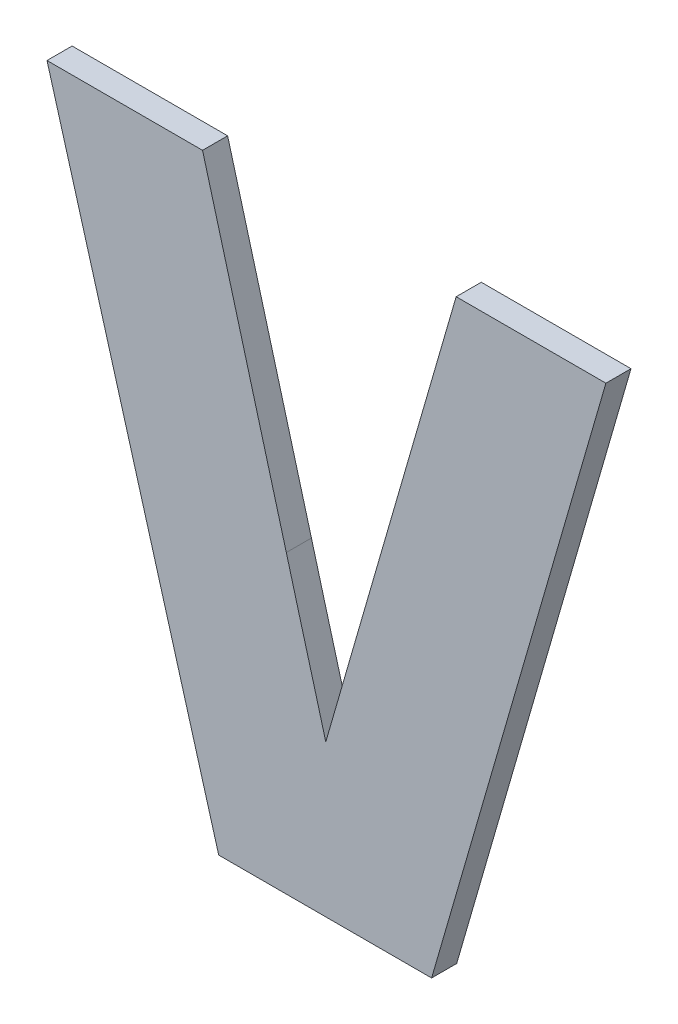
ISO-10303-21;
HEADER;
FILE_DESCRIPTION(('STEP AP214'),'2;1');
FILE_NAME('part.step','',(''),(''),'','','');
FILE_SCHEMA(('AUTOMOTIVE_DESIGN { 1 0 10303 214 1 1 1 1 }'));
ENDSEC;
DATA;
#1=APPLICATION_CONTEXT('core data for automotive mechanical design processes');
#2=APPLICATION_PROTOCOL_DEFINITION('international standard','automotive_design',2000,#1);
#3=PRODUCT_CONTEXT('',#1,'mechanical');
#4=PRODUCT('Part','Part','',(#3));
#5=PRODUCT_RELATED_PRODUCT_CATEGORY('part','',(#4));
#6=PRODUCT_DEFINITION_FORMATION('','',#4);
#7=PRODUCT_DEFINITION_CONTEXT('part definition',#1,'design');
#8=PRODUCT_DEFINITION('design','',#6,#7);
#9=PRODUCT_DEFINITION_SHAPE('','',#8);
#10=(LENGTH_UNIT() NAMED_UNIT(*) SI_UNIT(.MILLI.,.METRE.));
#11=(NAMED_UNIT(*) PLANE_ANGLE_UNIT() SI_UNIT($,.RADIAN.));
#12=(NAMED_UNIT(*) SI_UNIT($,.STERADIAN.) SOLID_ANGLE_UNIT());
#13=UNCERTAINTY_MEASURE_WITH_UNIT(LENGTH_MEASURE(1.E-05),#10,'distance_accuracy_value','');
#14=(GEOMETRIC_REPRESENTATION_CONTEXT(3) GLOBAL_UNCERTAINTY_ASSIGNED_CONTEXT((#13)) GLOBAL_UNIT_ASSIGNED_CONTEXT((#10,
#11,#12)) REPRESENTATION_CONTEXT('',''));
#15=CARTESIAN_POINT('',(0.,0.,0.));
#16=DIRECTION('',(0.,0.,1.));
#17=DIRECTION('',(1.,0.,0.));
#18=AXIS2_PLACEMENT_3D('',#15,#16,#17);
#19=CARTESIAN_POINT('',(1.78786057692204,-12.5,0.5));
#20=DIRECTION('',(0.,1.,0.));
#21=DIRECTION('',(0.,0.,1.));
#22=AXIS2_PLACEMENT_3D('',#19,#20,#21);
#23=PLANE('',#22);
#24=DIRECTION('',(-1.,0.,0.));
#25=VECTOR('',#24,1.);
#26=CARTESIAN_POINT('',(1.78786057692204,-12.5,1.));
#27=LINE('',#26,#25);
#28=CARTESIAN_POINT('',(1.78786057692204,-12.5,1.));
#29=VERTEX_POINT('',#28);
#30=CARTESIAN_POINT('',(-2.45392628205232,-12.5,1.));
#31=VERTEX_POINT('',#30);
#32=EDGE_CURVE('E123',#29,#31,#27,.T.);
#33=ORIENTED_EDGE('',*,*,#32,.T.);
#34=DIRECTION('',(0.,0.,1.));
#35=VECTOR('',#34,1.);
#36=CARTESIAN_POINT('',(-2.45392628205232,-12.5,0.5));
#37=LINE('',#36,#35);
#38=CARTESIAN_POINT('',(-2.45392628205232,-12.5,0.5));
#39=VERTEX_POINT('',#38);
#40=EDGE_CURVE('E125',#39,#31,#37,.T.);
#41=ORIENTED_EDGE('',*,*,#40,.F.);
#42=DIRECTION('',(-1.,0.,0.));
#43=VECTOR('',#42,1.);
#44=CARTESIAN_POINT('',(1.78786057692204,-12.5,0.5));
#45=LINE('',#44,#43);
#46=CARTESIAN_POINT('',(1.78786057692204,-12.5,0.5));
#47=VERTEX_POINT('',#46);
#48=EDGE_CURVE('E115',#47,#39,#45,.T.);
#49=ORIENTED_EDGE('',*,*,#48,.F.);
#50=DIRECTION('',(0.,0.,1.));
#51=VECTOR('',#50,1.);
#52=CARTESIAN_POINT('',(1.78786057692204,-12.5,0.5));
#53=LINE('',#52,#51);
#54=EDGE_CURVE('E113',#47,#29,#53,.T.);
#55=ORIENTED_EDGE('',*,*,#54,.T.);
#56=EDGE_LOOP('',(#33,#41,#49,#55));
#57=FACE_BOUND('',#56,.T.);
#58=ADVANCED_FACE('F39',(#57),#23,.F.);
#59=CARTESIAN_POINT('',(-0.32051282051386,-9.48016826923077,0.5));
#60=CARTESIAN_POINT('',(-0.227569577013121,-9.15282227397761,0.5));
#61=CARTESIAN_POINT('',(-0.0515148779217082,-8.53275782902831,0.5));
#62=CARTESIAN_POINT('',(0.204879934053548,-7.66094431447623,0.5));
#63=CARTESIAN_POINT('',(0.425315182795826,-6.89592763521583,0.5));
#64=CARTESIAN_POINT('',(0.562495621886022,-6.42359049696538,0.5));
#65=CARTESIAN_POINT('',(0.626001602563063,-6.20492788461538,0.5));
#66=B_SPLINE_CURVE_WITH_KNOTS('',3,(#59,#60,#61,#62,#63,#64,#65),.UNSPECIFIED.,.F.,.F.,(4,1,1,1,
4),(0.,0.299433006450165,0.567191178863927,0.799636531168644,1.),.UNSPECIFIED.);
#67=DIRECTION('',(0.,0.,1.));
#68=VECTOR('',#67,1.);
#69=SURFACE_OF_LINEAR_EXTRUSION('',#66,#68);
#70=CARTESIAN_POINT('',(-0.32051282051386,-9.48016826923077,1.));
#71=CARTESIAN_POINT('',(-0.227569577013121,-9.15282227397761,1.));
#72=CARTESIAN_POINT('',(-0.0515148779217082,-8.53275782902831,1.));
#73=CARTESIAN_POINT('',(0.204879934053548,-7.66094431447623,1.));
#74=CARTESIAN_POINT('',(0.425315182795826,-6.89592763521583,1.));
#75=CARTESIAN_POINT('',(0.562495621886022,-6.42359049696538,1.));
#76=CARTESIAN_POINT('',(0.626001602563063,-6.20492788461538,1.));
#77=B_SPLINE_CURVE_WITH_KNOTS('',3,(#70,#71,#72,#73,#74,#75,#76),.UNSPECIFIED.,.F.,.F.,(4,1,1,1,
4),(0.,0.299433006450165,0.567191178863927,0.799636531168644,1.),.UNSPECIFIED.);
#78=CARTESIAN_POINT('',(-0.32051282051386,-9.48016826923077,1.));
#79=VERTEX_POINT('',#78);
#80=CARTESIAN_POINT('',(0.626001602563063,-6.20492788461538,1.));
#81=VERTEX_POINT('',#80);
#82=EDGE_CURVE('E118',#79,#81,#77,.T.);
#83=ORIENTED_EDGE('',*,*,#82,.T.);
#84=DIRECTION('',(0.,0.,1.));
#85=VECTOR('',#84,1.);
#86=CARTESIAN_POINT('',(0.626001602563063,-6.20492788461538,0.5));
#87=LINE('',#86,#85);
#88=CARTESIAN_POINT('',(0.626001602563063,-6.20492788461538,0.5));
#89=VERTEX_POINT('',#88);
#90=EDGE_CURVE('E139',#89,#81,#87,.T.);
#91=ORIENTED_EDGE('',*,*,#90,.F.);
#92=CARTESIAN_POINT('',(-0.32051282051386,-9.48016826923077,0.5));
#93=VERTEX_POINT('',#92);
#94=EDGE_CURVE('E190',#93,#89,#66,.T.);
#95=ORIENTED_EDGE('',*,*,#94,.F.);
#96=DIRECTION('',(0.,0.,1.));
#97=VECTOR('',#96,1.);
#98=CARTESIAN_POINT('',(-0.32051282051386,-9.48016826923077,0.5));
#99=LINE('',#98,#97);
#100=EDGE_CURVE('E163',#93,#79,#99,.T.);
#101=ORIENTED_EDGE('',*,*,#100,.T.);
#102=EDGE_LOOP('',(#83,#91,#95,#101));
#103=FACE_BOUND('',#102,.T.);
#104=ADVANCED_FACE('F200',(#103),#69,.F.);
#105=CARTESIAN_POINT('',(-1.10677083333437,-6.60556891025641,0.5));
#106=CARTESIAN_POINT('',(-1.0543208011643,-6.79234360279481,0.5));
#107=CARTESIAN_POINT('',(-0.954685270709109,-7.14714596986153,0.5));
#108=CARTESIAN_POINT('',(-0.824086425798062,-7.65346097320304,0.5));
#109=CARTESIAN_POINT('',(-0.694575493266769,-8.09874418681304,0.5));
#110=CARTESIAN_POINT('',(-0.591562316920101,-8.48875016605581,0.5));
#111=CARTESIAN_POINT('',(-0.502413037833707,-8.8195488627093,0.5));
#112=CARTESIAN_POINT('',(-0.423467537856964,-9.09017175422705,0.5));
#113=CARTESIAN_POINT('',(-0.372691915008013,-9.30591536239712,0.5));
#114=CARTESIAN_POINT('',(-0.33597334291419,-9.42853761148284,0.5));
#115=CARTESIAN_POINT('',(-0.32051282051386,-9.48016826923077,0.5));
#116=B_SPLINE_CURVE_WITH_KNOTS('',3,(#105,#106,#107,#108,#109,#110,#111,#112,#113,#114,#115),
.UNSPECIFIED.,.F.,.F.,(4,1,1,1,1,1,1,1,4),(0.,0.195279953533646,0.370959195878058,
0.526302240592786,0.662039984591536,0.776996421772981,0.871173310115105,0.945756934130323,1.),.UNSPECIFIED.);
#117=DIRECTION('',(0.,0.,1.));
#118=VECTOR('',#117,1.);
#119=SURFACE_OF_LINEAR_EXTRUSION('',#116,#118);
#120=CARTESIAN_POINT('',(-1.10677083333437,-6.60556891025641,1.));
#121=CARTESIAN_POINT('',(-1.0543208011643,-6.79234360279481,1.));
#122=CARTESIAN_POINT('',(-0.954685270709109,-7.14714596986153,1.));
#123=CARTESIAN_POINT('',(-0.824086425798062,-7.65346097320304,1.));
#124=CARTESIAN_POINT('',(-0.694575493266769,-8.09874418681304,1.));
#125=CARTESIAN_POINT('',(-0.591562316920101,-8.48875016605581,1.));
#126=CARTESIAN_POINT('',(-0.502413037833707,-8.8195488627093,1.));
#127=CARTESIAN_POINT('',(-0.423467537856964,-9.09017175422705,1.));
#128=CARTESIAN_POINT('',(-0.372691915008013,-9.30591536239712,1.));
#129=CARTESIAN_POINT('',(-0.33597334291419,-9.42853761148284,1.));
#130=CARTESIAN_POINT('',(-0.32051282051386,-9.48016826923077,1.));
#131=B_SPLINE_CURVE_WITH_KNOTS('',3,(#120,#121,#122,#123,#124,#125,#126,#127,#128,#129,#130),
.UNSPECIFIED.,.F.,.F.,(4,1,1,1,1,1,1,1,4),(0.,0.195279953533646,0.370959195878058,
0.526302240592786,0.662039984591536,0.776996421772981,0.871173310115105,0.945756934130323,1.),.UNSPECIFIED.);
#132=CARTESIAN_POINT('',(-1.10677083333437,-6.60556891025641,1.));
#133=VERTEX_POINT('',#132);
#134=EDGE_CURVE('E173',#133,#79,#131,.T.);
#135=ORIENTED_EDGE('',*,*,#134,.T.);
#136=ORIENTED_EDGE('',*,*,#100,.F.);
#137=CARTESIAN_POINT('',(-1.10677083333437,-6.60556891025641,0.5));
#138=VERTEX_POINT('',#137);
#139=EDGE_CURVE('E147',#138,#93,#116,.T.);
#140=ORIENTED_EDGE('',*,*,#139,.F.);
#141=DIRECTION('',(0.,0.,1.));
#142=VECTOR('',#141,1.);
#143=CARTESIAN_POINT('',(-1.10677083333437,-6.60556891025641,0.5));
#144=LINE('',#143,#142);
#145=EDGE_CURVE('E177',#138,#133,#144,.T.);
#146=ORIENTED_EDGE('',*,*,#145,.T.);
#147=EDGE_LOOP('',(#135,#136,#140,#146));
#148=FACE_BOUND('',#147,.T.);
#149=ADVANCED_FACE('F205',(#148),#119,.F.);
#150=CARTESIAN_POINT('',(8.58165516531608,6.47238776818213,0.5));
#151=DIRECTION('',(0.,0.,1.));
#152=DIRECTION('',(1.,0.,0.));
#153=AXIS2_PLACEMENT_3D('',#150,#151,#152);
#154=PLANE('',#153);
#155=DIRECTION('',(-0.274162439918492,0.961683397245652,0.));
#156=VECTOR('',#155,1.);
#157=CARTESIAN_POINT('',(-2.45392628205232,-12.5,0.5));
#158=LINE('',#157,#156);
#159=CARTESIAN_POINT('',(-5.87495786941737,-0.5,0.499999999999602));
#160=VERTEX_POINT('',#159);
#161=EDGE_CURVE('E135',#39,#160,#158,.T.);
#162=ORIENTED_EDGE('',*,*,#161,.T.);
#163=DIRECTION('',(1.,0.,0.));
#164=VECTOR('',#163,1.);
#165=CARTESIAN_POINT('',(8.58165516531608,-0.5,0.499999999999922));
#166=LINE('',#165,#164);
#167=CARTESIAN_POINT('',(-2.77599976476227,-0.5,0.499999999999679));
#168=VERTEX_POINT('',#167);
#169=EDGE_CURVE('E150',#160,#168,#166,.T.);
#170=ORIENTED_EDGE('',*,*,#169,.T.);
#171=DIRECTION('',(0.263716401102366,-0.9646002590657,0.));
#172=VECTOR('',#171,1.);
#173=CARTESIAN_POINT('',(-6.33012820512924,12.5,0.5));
#174=LINE('',#173,#172);
#175=EDGE_CURVE('E143',#168,#138,#174,.T.);
#176=ORIENTED_EDGE('',*,*,#175,.T.);
#177=ORIENTED_EDGE('',*,*,#139,.T.);
#178=ORIENTED_EDGE('',*,*,#94,.T.);
#179=DIRECTION('',(0.278014363432107,0.960576917131283,0.));
#180=VECTOR('',#179,1.);
#181=CARTESIAN_POINT('',(0.626001602563063,-6.20492788461538,0.5));
#182=LINE('',#181,#180);
#183=CARTESIAN_POINT('',(2.27714672793635,-0.5,0.499999999999804));
#184=VERTEX_POINT('',#183);
#185=EDGE_CURVE('E156',#89,#184,#182,.T.);
#186=ORIENTED_EDGE('',*,*,#185,.T.);
#187=CARTESIAN_POINT('',(5.2607105915977,-0.5,0.499999999999878));
#188=VERTEX_POINT('',#187);
#189=EDGE_CURVE('E43',#184,#188,#166,.T.);
#190=ORIENTED_EDGE('',*,*,#189,.T.);
#191=DIRECTION('',(-0.277996462718852,-0.960582097853071,0.));
#192=VECTOR('',#191,1.);
#193=CARTESIAN_POINT('',(6.72576121794768,4.56229967948718,0.5));
#194=LINE('',#193,#192);
#195=EDGE_CURVE('E110',#188,#47,#194,.T.);
#196=ORIENTED_EDGE('',*,*,#195,.T.);
#197=ORIENTED_EDGE('',*,*,#48,.T.);
#198=EDGE_LOOP('',(#162,#170,#176,#177,#178,#186,#190,#196,#197));
#199=FACE_BOUND('',#198,.T.);
#200=ADVANCED_FACE('F108',(#199),#154,.F.);
#201=CARTESIAN_POINT('',(0.626001602563063,-6.20492788461538,0.5));
#202=DIRECTION('',(0.960576917131283,-0.278014363432107,0.));
#203=DIRECTION('',(0.278014363432107,0.960576917131283,0.));
#204=AXIS2_PLACEMENT_3D('',#201,#202,#203);
#205=PLANE('',#204);
#206=DIRECTION('',(0.278014363432107,0.960576917131283,0.));
#207=VECTOR('',#206,1.);
#208=CARTESIAN_POINT('',(0.626001602563063,-6.20492788461538,1.));
#209=LINE('',#208,#207);
#210=CARTESIAN_POINT('',(2.27714672793635,-0.5,1.));
#211=VERTEX_POINT('',#210);
#212=EDGE_CURVE('E128',#81,#211,#209,.T.);
#213=ORIENTED_EDGE('',*,*,#212,.T.);
#214=DIRECTION('',(0.,0.,-1.));
#215=VECTOR('',#214,1.);
#216=CARTESIAN_POINT('',(2.27714672793635,-0.5,0.5));
#217=LINE('',#216,#215);
#218=EDGE_CURVE('E74',#211,#184,#217,.T.);
#219=ORIENTED_EDGE('',*,*,#218,.T.);
#220=ORIENTED_EDGE('',*,*,#185,.F.);
#221=ORIENTED_EDGE('',*,*,#90,.T.);
#222=EDGE_LOOP('',(#213,#219,#220,#221));
#223=FACE_BOUND('',#222,.T.);
#224=ADVANCED_FACE('F153',(#223),#205,.F.);
#225=CARTESIAN_POINT('',(-6.33012820512924,12.5,0.5));
#226=DIRECTION('',(-0.9646002590657,-0.263716401102366,0.));
#227=DIRECTION('',(0.263716401102366,-0.9646002590657,0.));
#228=AXIS2_PLACEMENT_3D('',#225,#226,#227);
#229=PLANE('',#228);
#230=ORIENTED_EDGE('',*,*,#175,.F.);
#231=DIRECTION('',(0.,0.,1.));
#232=VECTOR('',#231,1.);
#233=CARTESIAN_POINT('',(-2.77599976476227,-0.5,0.5));
#234=LINE('',#233,#232);
#235=CARTESIAN_POINT('',(-2.77599976476227,-0.5,1.));
#236=VERTEX_POINT('',#235);
#237=EDGE_CURVE('E136',#168,#236,#234,.T.);
#238=ORIENTED_EDGE('',*,*,#237,.T.);
#239=DIRECTION('',(0.263716401102366,-0.9646002590657,0.));
#240=VECTOR('',#239,1.);
#241=CARTESIAN_POINT('',(-6.33012820512924,12.5,1.));
#242=LINE('',#241,#240);
#243=EDGE_CURVE('E137',#236,#133,#242,.T.);
#244=ORIENTED_EDGE('',*,*,#243,.T.);
#245=ORIENTED_EDGE('',*,*,#145,.F.);
#246=EDGE_LOOP('',(#230,#238,#244,#245));
#247=FACE_BOUND('',#246,.T.);
#248=ADVANCED_FACE('F207',(#247),#229,.F.);
#249=CARTESIAN_POINT('',(-2.45392628205232,-12.5,0.5));
#250=DIRECTION('',(0.961683397245652,0.274162439918492,0.));
#251=DIRECTION('',(-0.274162439918492,0.961683397245652,0.));
#252=AXIS2_PLACEMENT_3D('',#249,#250,#251);
#253=PLANE('',#252);
#254=DIRECTION('',(-0.274162439918492,0.961683397245652,0.));
#255=VECTOR('',#254,1.);
#256=CARTESIAN_POINT('',(-2.45392628205232,-12.5,1.));
#257=LINE('',#256,#255);
#258=CARTESIAN_POINT('',(-5.87495786941737,-0.5,1.));
#259=VERTEX_POINT('',#258);
#260=EDGE_CURVE('E134',#31,#259,#257,.T.);
#261=ORIENTED_EDGE('',*,*,#260,.T.);
#262=DIRECTION('',(0.,0.,-1.));
#263=VECTOR('',#262,1.);
#264=CARTESIAN_POINT('',(-5.87495786941737,-0.5,0.5));
#265=LINE('',#264,#263);
#266=EDGE_CURVE('E59',#259,#160,#265,.T.);
#267=ORIENTED_EDGE('',*,*,#266,.T.);
#268=ORIENTED_EDGE('',*,*,#161,.F.);
#269=ORIENTED_EDGE('',*,*,#40,.T.);
#270=EDGE_LOOP('',(#261,#267,#268,#269));
#271=FACE_BOUND('',#270,.T.);
#272=ADVANCED_FACE('F206',(#271),#253,.F.);
#273=CARTESIAN_POINT('',(6.72576121794768,4.56229967948718,0.5));
#274=DIRECTION('',(-0.960582097853071,0.277996462718852,0.));
#275=DIRECTION('',(-0.277996462718852,-0.960582097853071,0.));
#276=AXIS2_PLACEMENT_3D('',#273,#274,#275);
#277=PLANE('',#276);
#278=ORIENTED_EDGE('',*,*,#195,.F.);
#279=DIRECTION('',(0.,0.,1.));
#280=VECTOR('',#279,1.);
#281=CARTESIAN_POINT('',(5.2607105915977,-0.5,0.5));
#282=LINE('',#281,#280);
#283=CARTESIAN_POINT('',(5.2607105915977,-0.5,1.));
#284=VERTEX_POINT('',#283);
#285=EDGE_CURVE('E141',#188,#284,#282,.T.);
#286=ORIENTED_EDGE('',*,*,#285,.T.);
#287=DIRECTION('',(-0.277996462718852,-0.960582097853071,0.));
#288=VECTOR('',#287,1.);
#289=CARTESIAN_POINT('',(6.72576121794768,4.56229967948718,1.));
#290=LINE('',#289,#288);
#291=EDGE_CURVE('E84',#284,#29,#290,.T.);
#292=ORIENTED_EDGE('',*,*,#291,.T.);
#293=ORIENTED_EDGE('',*,*,#54,.F.);
#294=EDGE_LOOP('',(#278,#286,#292,#293));
#295=FACE_BOUND('',#294,.T.);
#296=ADVANCED_FACE('F117',(#295),#277,.F.);
#297=CARTESIAN_POINT('',(8.58165516531608,6.47238776818213,1.));
#298=DIRECTION('',(0.,0.,1.));
#299=DIRECTION('',(1.,0.,0.));
#300=AXIS2_PLACEMENT_3D('',#297,#298,#299);
#301=PLANE('',#300);
#302=ORIENTED_EDGE('',*,*,#291,.F.);
#303=DIRECTION('',(-1.,0.,0.));
#304=VECTOR('',#303,1.);
#305=CARTESIAN_POINT('',(-17.,-0.5,1.));
#306=LINE('',#305,#304);
#307=EDGE_CURVE('E47',#284,#211,#306,.T.);
#308=ORIENTED_EDGE('',*,*,#307,.T.);
#309=ORIENTED_EDGE('',*,*,#212,.F.);
#310=ORIENTED_EDGE('',*,*,#82,.F.);
#311=ORIENTED_EDGE('',*,*,#134,.F.);
#312=ORIENTED_EDGE('',*,*,#243,.F.);
#313=EDGE_CURVE('E11',#236,#259,#306,.T.);
#314=ORIENTED_EDGE('',*,*,#313,.T.);
#315=ORIENTED_EDGE('',*,*,#260,.F.);
#316=ORIENTED_EDGE('',*,*,#32,.F.);
#317=EDGE_LOOP('',(#302,#308,#309,#310,#311,#312,#314,#315,#316));
#318=FACE_BOUND('',#317,.T.);
#319=ADVANCED_FACE('F41',(#318),#301,.T.);
#320=CARTESIAN_POINT('',(-17.,-0.5,1.));
#321=DIRECTION('',(0.,-1.,0.));
#322=DIRECTION('',(0.,0.,-1.));
#323=AXIS2_PLACEMENT_3D('',#320,#321,#322);
#324=PLANE('',#323);
#325=ORIENTED_EDGE('',*,*,#189,.F.);
#326=ORIENTED_EDGE('',*,*,#218,.F.);
#327=ORIENTED_EDGE('',*,*,#307,.F.);
#328=ORIENTED_EDGE('',*,*,#285,.F.);
#329=EDGE_LOOP('',(#325,#326,#327,#328));
#330=FACE_BOUND('',#329,.T.);
#331=ADVANCED_FACE('F211',(#330),#324,.F.);
#332=ORIENTED_EDGE('',*,*,#313,.F.);
#333=ORIENTED_EDGE('',*,*,#237,.F.);
#334=ORIENTED_EDGE('',*,*,#169,.F.);
#335=ORIENTED_EDGE('',*,*,#266,.F.);
#336=EDGE_LOOP('',(#332,#333,#334,#335));
#337=FACE_BOUND('',#336,.T.);
#338=ADVANCED_FACE('F213',(#337),#324,.F.);
#339=CLOSED_SHELL('',(#58,#104,#149,#200,#224,#248,#272,#296,#319,#331,#338));
#340=MANIFOLD_SOLID_BREP('B2',#339);
#341=ADVANCED_BREP_SHAPE_REPRESENTATION('',(#18,#340),#14);
#342=SHAPE_DEFINITION_REPRESENTATION(#9,#341);
ENDSEC;
END-ISO-10303-21;
